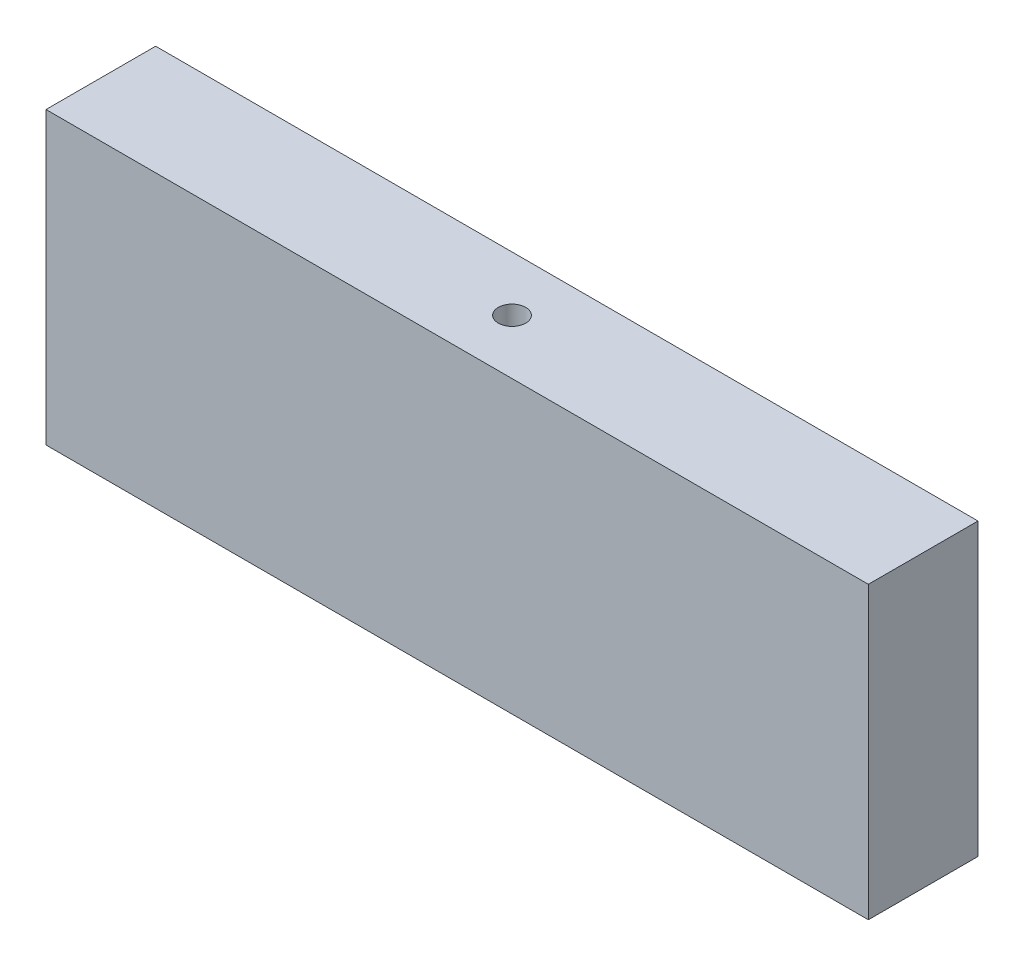
ISO-10303-21;
HEADER;
FILE_DESCRIPTION(('STEP AP214'),'2;1');
FILE_NAME('part.step','',(''),(''),'','','');
FILE_SCHEMA(('AUTOMOTIVE_DESIGN { 1 0 10303 214 1 1 1 1 }'));
ENDSEC;
DATA;
#1=APPLICATION_CONTEXT('core data for automotive mechanical design processes');
#2=APPLICATION_PROTOCOL_DEFINITION('international standard','automotive_design',2000,#1);
#3=PRODUCT_CONTEXT('',#1,'mechanical');
#4=PRODUCT('Part','Part','',(#3));
#5=PRODUCT_RELATED_PRODUCT_CATEGORY('part','',(#4));
#6=PRODUCT_DEFINITION_FORMATION('','',#4);
#7=PRODUCT_DEFINITION_CONTEXT('part definition',#1,'design');
#8=PRODUCT_DEFINITION('design','',#6,#7);
#9=PRODUCT_DEFINITION_SHAPE('','',#8);
#10=(LENGTH_UNIT() NAMED_UNIT(*) SI_UNIT(.MILLI.,.METRE.));
#11=(NAMED_UNIT(*) PLANE_ANGLE_UNIT() SI_UNIT($,.RADIAN.));
#12=(NAMED_UNIT(*) SI_UNIT($,.STERADIAN.) SOLID_ANGLE_UNIT());
#13=UNCERTAINTY_MEASURE_WITH_UNIT(LENGTH_MEASURE(1.E-05),#10,'distance_accuracy_value','');
#14=(GEOMETRIC_REPRESENTATION_CONTEXT(3) GLOBAL_UNCERTAINTY_ASSIGNED_CONTEXT((#13)) GLOBAL_UNIT_ASSIGNED_CONTEXT((#10,
#11,#12)) REPRESENTATION_CONTEXT('',''));
#15=CARTESIAN_POINT('',(0.,0.,0.));
#16=DIRECTION('',(0.,0.,1.));
#17=DIRECTION('',(1.,0.,0.));
#18=AXIS2_PLACEMENT_3D('',#15,#16,#17);
#19=CARTESIAN_POINT('',(75.0000000000008,26.5,10.0000000000011));
#20=DIRECTION('',(-1.00000000000001,0.,0.));
#21=DIRECTION('',(0.,-1.,0.));
#22=AXIS2_PLACEMENT_3D('',#19,#20,#21);
#23=PLANE('',#22);
#24=DIRECTION('',(0.,1.,0.));
#25=VECTOR('',#24,1.);
#26=CARTESIAN_POINT('',(75.000000000001,26.5,-10.0000000000011));
#27=LINE('',#26,#25);
#28=CARTESIAN_POINT('',(75.000000000001,-26.5,-10.0000000000011));
#29=VERTEX_POINT('',#28);
#30=CARTESIAN_POINT('',(75.000000000001,26.5,-10.0000000000011));
#31=VERTEX_POINT('',#30);
#32=EDGE_CURVE('E97',#29,#31,#27,.T.);
#33=ORIENTED_EDGE('',*,*,#32,.T.);
#34=DIRECTION('',(0.,0.,-1.00000000000001));
#35=VECTOR('',#34,1.);
#36=CARTESIAN_POINT('',(75.0000000000008,26.5,10.0000000000011));
#37=LINE('',#36,#35);
#38=CARTESIAN_POINT('',(75.0000000000008,26.5,10.0000000000011));
#39=VERTEX_POINT('',#38);
#40=EDGE_CURVE('E11',#39,#31,#37,.T.);
#41=ORIENTED_EDGE('',*,*,#40,.F.);
#42=DIRECTION('',(0.,1.,0.));
#43=VECTOR('',#42,1.);
#44=CARTESIAN_POINT('',(75.0000000000008,26.5,10.0000000000011));
#45=LINE('',#44,#43);
#46=CARTESIAN_POINT('',(75.0000000000008,-26.5,10.0000000000011));
#47=VERTEX_POINT('',#46);
#48=EDGE_CURVE('E85',#47,#39,#45,.T.);
#49=ORIENTED_EDGE('',*,*,#48,.F.);
#50=DIRECTION('',(0.,0.,-1.00000000000001));
#51=VECTOR('',#50,1.);
#52=CARTESIAN_POINT('',(75.0000000000008,-26.5,10.0000000000011));
#53=LINE('',#52,#51);
#54=EDGE_CURVE('E93',#47,#29,#53,.T.);
#55=ORIENTED_EDGE('',*,*,#54,.T.);
#56=EDGE_LOOP('',(#33,#41,#49,#55));
#57=FACE_BOUND('',#56,.T.);
#58=ADVANCED_FACE('F34',(#57),#23,.F.);
#59=CARTESIAN_POINT('',(-75.0000000000007,26.5,10.0000000000002));
#60=DIRECTION('',(0.,-1.,0.));
#61=DIRECTION('',(0.,0.,-1.00000000000001));
#62=AXIS2_PLACEMENT_3D('',#59,#60,#61);
#63=PLANE('',#62);
#64=CARTESIAN_POINT('',(0.,26.5,0.));
#65=DIRECTION('',(0.,1.,0.));
#66=DIRECTION('',(0.,0.,1.00000000000001));
#67=AXIS2_PLACEMENT_3D('',#64,#65,#66);
#68=CIRCLE('',#67,2.5);
#69=CARTESIAN_POINT('',(0.,26.5,2.50000000000002));
#70=VERTEX_POINT('',#69);
#71=EDGE_CURVE('E113',#70,#70,#68,.T.);
#72=ORIENTED_EDGE('',*,*,#71,.F.);
#73=EDGE_LOOP('',(#72));
#74=FACE_BOUND('',#73,.T.);
#75=DIRECTION('',(-1.00000000000001,0.,0.));
#76=VECTOR('',#75,1.);
#77=CARTESIAN_POINT('',(-75.0000000000004,26.5,-9.99999999999868));
#78=LINE('',#77,#76);
#79=CARTESIAN_POINT('',(-75.0000000000004,26.5,-9.99999999999868));
#80=VERTEX_POINT('',#79);
#81=EDGE_CURVE('E89',#31,#80,#78,.T.);
#82=ORIENTED_EDGE('',*,*,#81,.T.);
#83=DIRECTION('',(0.,0.,-1.00000000000001));
#84=VECTOR('',#83,1.);
#85=CARTESIAN_POINT('',(-75.0000000000007,26.5,10.0000000000002));
#86=LINE('',#85,#84);
#87=CARTESIAN_POINT('',(-75.0000000000007,26.5,10.0000000000002));
#88=VERTEX_POINT('',#87);
#89=EDGE_CURVE('E42',#88,#80,#86,.T.);
#90=ORIENTED_EDGE('',*,*,#89,.F.);
#91=DIRECTION('',(-1.00000000000001,0.,0.));
#92=VECTOR('',#91,1.);
#93=CARTESIAN_POINT('',(-75.0000000000007,26.5,10.0000000000002));
#94=LINE('',#93,#92);
#95=EDGE_CURVE('E80',#39,#88,#94,.T.);
#96=ORIENTED_EDGE('',*,*,#95,.F.);
#97=ORIENTED_EDGE('',*,*,#40,.T.);
#98=EDGE_LOOP('',(#82,#90,#96,#97));
#99=FACE_BOUND('',#98,.T.);
#100=ADVANCED_FACE('F88',(#74,#99),#63,.F.);
#101=CARTESIAN_POINT('',(-75.0000000000007,26.5,10.0000000000002));
#102=DIRECTION('',(1.00000000000001,0.,0.));
#103=DIRECTION('',(0.,0.,-1.00000000000001));
#104=AXIS2_PLACEMENT_3D('',#101,#102,#103);
#105=PLANE('',#104);
#106=DIRECTION('',(0.,-1.,0.));
#107=VECTOR('',#106,1.);
#108=CARTESIAN_POINT('',(-75.0000000000004,26.5,-9.99999999999868));
#109=LINE('',#108,#107);
#110=CARTESIAN_POINT('',(-75.0000000000004,-26.5,-9.99999999999868));
#111=VERTEX_POINT('',#110);
#112=EDGE_CURVE('E67',#80,#111,#109,.T.);
#113=ORIENTED_EDGE('',*,*,#112,.T.);
#114=DIRECTION('',(0.,0.,-1.00000000000001));
#115=VECTOR('',#114,1.);
#116=CARTESIAN_POINT('',(-75.0000000000007,-26.5,10.0000000000002));
#117=LINE('',#116,#115);
#118=CARTESIAN_POINT('',(-75.0000000000007,-26.5,10.0000000000002));
#119=VERTEX_POINT('',#118);
#120=EDGE_CURVE('E90',#119,#111,#117,.T.);
#121=ORIENTED_EDGE('',*,*,#120,.F.);
#122=DIRECTION('',(0.,-1.,0.));
#123=VECTOR('',#122,1.);
#124=CARTESIAN_POINT('',(-75.0000000000007,26.5,10.0000000000002));
#125=LINE('',#124,#123);
#126=EDGE_CURVE('E83',#88,#119,#125,.T.);
#127=ORIENTED_EDGE('',*,*,#126,.F.);
#128=ORIENTED_EDGE('',*,*,#89,.T.);
#129=EDGE_LOOP('',(#113,#121,#127,#128));
#130=FACE_BOUND('',#129,.T.);
#131=ADVANCED_FACE('F91',(#130),#105,.F.);
#132=CARTESIAN_POINT('',(-75.0000000000007,-26.5,10.0000000000002));
#133=DIRECTION('',(0.,1.,0.));
#134=DIRECTION('',(0.,0.,1.00000000000001));
#135=AXIS2_PLACEMENT_3D('',#132,#133,#134);
#136=PLANE('',#135);
#137=CARTESIAN_POINT('',(0.,-26.5,0.));
#138=DIRECTION('',(0.,1.,0.));
#139=DIRECTION('',(0.,0.,1.00000000000001));
#140=AXIS2_PLACEMENT_3D('',#137,#138,#139);
#141=CIRCLE('',#140,2.5);
#142=CARTESIAN_POINT('',(0.,-26.5,2.50000000000002));
#143=VERTEX_POINT('',#142);
#144=EDGE_CURVE('E100',#143,#143,#141,.T.);
#145=ORIENTED_EDGE('',*,*,#144,.T.);
#146=EDGE_LOOP('',(#145));
#147=FACE_BOUND('',#146,.T.);
#148=DIRECTION('',(1.00000000000001,0.,0.));
#149=VECTOR('',#148,1.);
#150=CARTESIAN_POINT('',(-75.0000000000004,-26.5,-9.99999999999868));
#151=LINE('',#150,#149);
#152=EDGE_CURVE('E73',#111,#29,#151,.T.);
#153=ORIENTED_EDGE('',*,*,#152,.T.);
#154=ORIENTED_EDGE('',*,*,#54,.F.);
#155=DIRECTION('',(1.00000000000001,0.,0.));
#156=VECTOR('',#155,1.);
#157=CARTESIAN_POINT('',(-75.0000000000007,-26.5,10.0000000000002));
#158=LINE('',#157,#156);
#159=EDGE_CURVE('E50',#119,#47,#158,.T.);
#160=ORIENTED_EDGE('',*,*,#159,.F.);
#161=ORIENTED_EDGE('',*,*,#120,.T.);
#162=EDGE_LOOP('',(#153,#154,#160,#161));
#163=FACE_BOUND('',#162,.T.);
#164=ADVANCED_FACE('F105',(#147,#163),#136,.F.);
#165=CARTESIAN_POINT('',(-4.44089209850063E-13,0.,10.0000000000002));
#166=DIRECTION('',(0.,0.,1.00000000000001));
#167=DIRECTION('',(1.00000000000001,0.,0.));
#168=AXIS2_PLACEMENT_3D('',#165,#166,#167);
#169=PLANE('',#168);
#170=ORIENTED_EDGE('',*,*,#48,.T.);
#171=ORIENTED_EDGE('',*,*,#95,.T.);
#172=ORIENTED_EDGE('',*,*,#126,.T.);
#173=ORIENTED_EDGE('',*,*,#159,.T.);
#174=EDGE_LOOP('',(#170,#171,#172,#173));
#175=FACE_BOUND('',#174,.T.);
#176=ADVANCED_FACE('F81',(#175),#169,.T.);
#177=CARTESIAN_POINT('',(0.,0.,-9.99999999999912));
#178=DIRECTION('',(0.,0.,1.00000000000001));
#179=DIRECTION('',(1.00000000000001,0.,0.));
#180=AXIS2_PLACEMENT_3D('',#177,#178,#179);
#181=PLANE('',#180);
#182=ORIENTED_EDGE('',*,*,#32,.F.);
#183=ORIENTED_EDGE('',*,*,#152,.F.);
#184=ORIENTED_EDGE('',*,*,#112,.F.);
#185=ORIENTED_EDGE('',*,*,#81,.F.);
#186=EDGE_LOOP('',(#182,#183,#184,#185));
#187=FACE_BOUND('',#186,.T.);
#188=ADVANCED_FACE('F108',(#187),#181,.F.);
#189=CARTESIAN_POINT('',(0.,-26.5,0.));
#190=DIRECTION('',(0.,1.,0.));
#191=DIRECTION('',(0.,0.,1.00000000000001));
#192=AXIS2_PLACEMENT_3D('',#189,#190,#191);
#193=CYLINDRICAL_SURFACE('',#192,2.5);
#194=CARTESIAN_POINT('',(0.,-26.5,2.50000000000002));
#195=CARTESIAN_POINT('',(0.,-25.9479166666667,2.50000000000002));
#196=CARTESIAN_POINT('',(0.,-25.3958333333333,2.50000000000002));
#197=CARTESIAN_POINT('',(0.,-24.2916666666667,2.50000000000002));
#198=CARTESIAN_POINT('',(0.,-23.7395833333333,2.50000000000002));
#199=CARTESIAN_POINT('',(0.,-22.6354166666667,2.50000000000002));
#200=CARTESIAN_POINT('',(0.,-22.0833333333333,2.50000000000002));
#201=CARTESIAN_POINT('',(0.,-20.9791666666667,2.50000000000002));
#202=CARTESIAN_POINT('',(0.,-20.4270833333333,2.50000000000002));
#203=CARTESIAN_POINT('',(0.,-19.3229166666667,2.50000000000002));
#204=CARTESIAN_POINT('',(0.,-18.7708333333333,2.50000000000002));
#205=CARTESIAN_POINT('',(0.,-17.6666666666667,2.50000000000002));
#206=CARTESIAN_POINT('',(0.,-17.1145833333333,2.50000000000002));
#207=CARTESIAN_POINT('',(0.,-16.0104166666667,2.50000000000002));
#208=CARTESIAN_POINT('',(0.,-15.4583333333333,2.50000000000002));
#209=CARTESIAN_POINT('',(0.,-14.3541666666667,2.50000000000002));
#210=CARTESIAN_POINT('',(0.,-13.8020833333333,2.50000000000002));
#211=CARTESIAN_POINT('',(0.,-12.6979166666667,2.50000000000002));
#212=CARTESIAN_POINT('',(0.,-12.1458333333333,2.50000000000002));
#213=CARTESIAN_POINT('',(0.,-11.0416666666667,2.50000000000002));
#214=CARTESIAN_POINT('',(0.,-10.4895833333333,2.50000000000002));
#215=CARTESIAN_POINT('',(0.,-9.38541666666666,2.50000000000002));
#216=CARTESIAN_POINT('',(0.,-8.83333333333333,2.50000000000002));
#217=CARTESIAN_POINT('',(0.,-7.72916666666666,2.50000000000002));
#218=CARTESIAN_POINT('',(0.,-7.17708333333333,2.50000000000002));
#219=CARTESIAN_POINT('',(0.,-6.07291666666666,2.50000000000002));
#220=CARTESIAN_POINT('',(0.,-5.52083333333333,2.50000000000002));
#221=CARTESIAN_POINT('',(0.,-4.41666666666666,2.50000000000002));
#222=CARTESIAN_POINT('',(0.,-3.86458333333333,2.50000000000002));
#223=CARTESIAN_POINT('',(0.,-2.76041666666666,2.50000000000002));
#224=CARTESIAN_POINT('',(0.,-2.20833333333333,2.50000000000002));
#225=CARTESIAN_POINT('',(0.,-1.10416666666666,2.50000000000002));
#226=CARTESIAN_POINT('',(0.,-0.55208333333333,2.50000000000002));
#227=CARTESIAN_POINT('',(0.,0.552083333333337,2.50000000000002));
#228=CARTESIAN_POINT('',(0.,1.10416666666667,2.50000000000002));
#229=CARTESIAN_POINT('',(0.,2.20833333333334,2.50000000000002));
#230=CARTESIAN_POINT('',(0.,2.76041666666667,2.50000000000002));
#231=CARTESIAN_POINT('',(0.,3.86458333333333,2.50000000000002));
#232=CARTESIAN_POINT('',(0.,4.41666666666667,2.50000000000002));
#233=CARTESIAN_POINT('',(0.,5.52083333333333,2.50000000000002));
#234=CARTESIAN_POINT('',(0.,6.07291666666666,2.50000000000002));
#235=CARTESIAN_POINT('',(0.,7.17708333333333,2.50000000000002));
#236=CARTESIAN_POINT('',(0.,7.72916666666667,2.50000000000002));
#237=CARTESIAN_POINT('',(0.,8.83333333333333,2.50000000000002));
#238=CARTESIAN_POINT('',(0.,9.38541666666666,2.50000000000002));
#239=CARTESIAN_POINT('',(0.,10.4895833333333,2.50000000000002));
#240=CARTESIAN_POINT('',(0.,11.0416666666667,2.50000000000002));
#241=CARTESIAN_POINT('',(0.,12.1458333333333,2.50000000000002));
#242=CARTESIAN_POINT('',(0.,12.6979166666667,2.50000000000002));
#243=CARTESIAN_POINT('',(0.,13.8020833333333,2.50000000000002));
#244=CARTESIAN_POINT('',(0.,14.3541666666667,2.50000000000002));
#245=CARTESIAN_POINT('',(0.,15.4583333333333,2.50000000000002));
#246=CARTESIAN_POINT('',(0.,16.0104166666667,2.50000000000002));
#247=CARTESIAN_POINT('',(0.,17.1145833333333,2.50000000000002));
#248=CARTESIAN_POINT('',(0.,17.6666666666667,2.50000000000002));
#249=CARTESIAN_POINT('',(0.,18.7708333333333,2.50000000000002));
#250=CARTESIAN_POINT('',(0.,19.3229166666667,2.50000000000002));
#251=CARTESIAN_POINT('',(0.,20.4270833333333,2.50000000000002));
#252=CARTESIAN_POINT('',(0.,20.9791666666667,2.50000000000002));
#253=CARTESIAN_POINT('',(0.,22.0833333333333,2.50000000000002));
#254=CARTESIAN_POINT('',(0.,22.6354166666667,2.50000000000002));
#255=CARTESIAN_POINT('',(0.,23.7395833333333,2.50000000000002));
#256=CARTESIAN_POINT('',(0.,24.2916666666667,2.50000000000002));
#257=CARTESIAN_POINT('',(0.,25.3958333333333,2.50000000000002));
#258=CARTESIAN_POINT('',(0.,25.9479166666667,2.50000000000002));
#259=CARTESIAN_POINT('',(0.,26.5,2.50000000000002));
#260=B_SPLINE_CURVE_WITH_KNOTS('',3,(#194,#195,#196,#197,#198,#199,#200,#201,#202,#203,#204,
#205,#206,#207,#208,#209,#210,#211,#212,#213,#214,#215,#216,#217,#218,#219,#220,#221,#222,#223,
#224,#225,#226,#227,#228,#229,#230,#231,#232,#233,#234,#235,#236,#237,#238,#239,#240,#241,#242,
#243,#244,#245,#246,#247,#248,#249,#250,#251,#252,#253,#254,#255,#256,#257,#258,#259),
.UNSPECIFIED.,.F.,.F.,(4,2,2,2,2,2,2,2,2,2,2,2,2,2,2,2,2,2,2,2,2,2,2,2,2,2,2,2,2,2,2,2,4),(0.,
1.65625,3.3125,4.96875,6.625,8.28125,9.9375,11.59375,13.25,14.90625,16.5625,18.21875,19.875,
21.53125,23.1875,24.84375,26.5,28.15625,29.8125,31.46875,33.125,34.78125,36.4375,38.09375,39.75,
41.40625,43.0625,44.71875,46.375,48.03125,49.6875,51.34375,53.),.UNSPECIFIED.);
#261=EDGE_CURVE('BSEAM117',#143,#70,#260,.T.);
#262=ORIENTED_EDGE('',*,*,#144,.F.);
#263=ORIENTED_EDGE('',*,*,#71,.T.);
#264=ORIENTED_EDGE('',*,*,#261,.T.);
#265=ORIENTED_EDGE('',*,*,#261,.F.);
#266=EDGE_LOOP('',(#262,#264,#263,#265));
#267=FACE_BOUND('',#266,.T.);
#268=ADVANCED_FACE('F117',(#267),#193,.F.);
#269=CLOSED_SHELL('',(#58,#100,#131,#164,#176,#188,#268));
#270=MANIFOLD_SOLID_BREP('B2',#269);
#271=ADVANCED_BREP_SHAPE_REPRESENTATION('',(#18,#270),#14);
#272=SHAPE_DEFINITION_REPRESENTATION(#9,#271);
ENDSEC;
END-ISO-10303-21;
